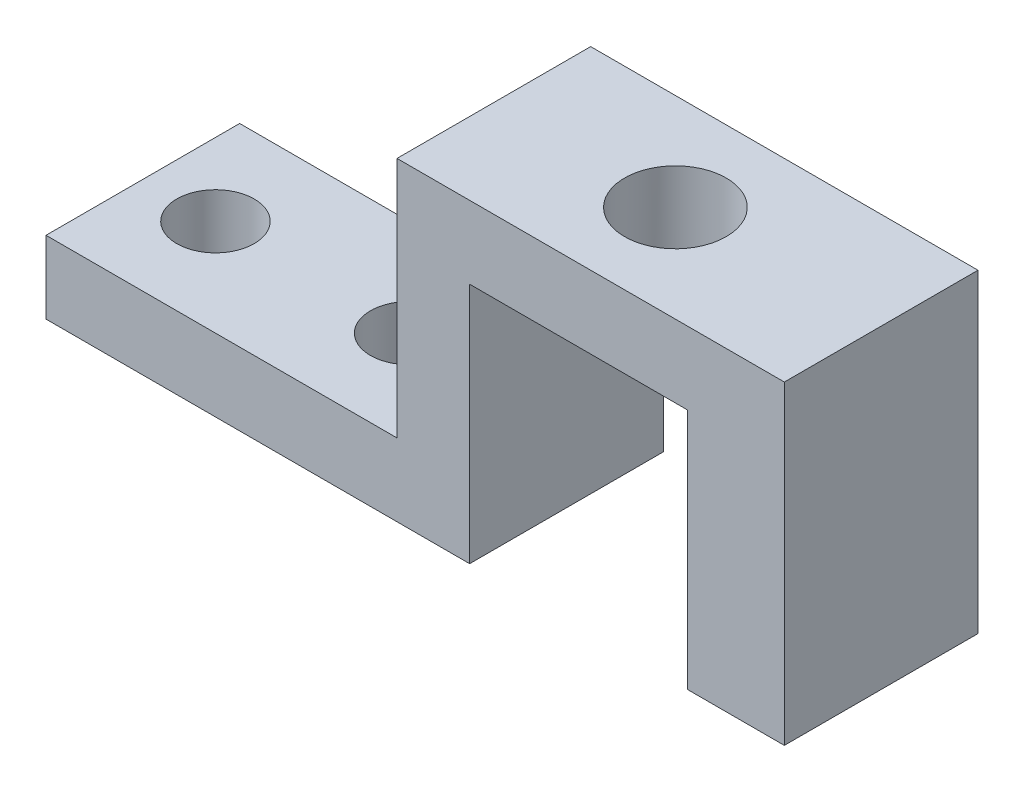
ISO-10303-21;
HEADER;
FILE_DESCRIPTION(('STEP AP214'),'2;1');
FILE_NAME('part.step','',(''),(''),'','','');
FILE_SCHEMA(('AUTOMOTIVE_DESIGN { 1 0 10303 214 1 1 1 1 }'));
ENDSEC;
DATA;
#1=APPLICATION_CONTEXT('core data for automotive mechanical design processes');
#2=APPLICATION_PROTOCOL_DEFINITION('international standard','automotive_design',2000,#1);
#3=PRODUCT_CONTEXT('',#1,'mechanical');
#4=PRODUCT('Part','Part','',(#3));
#5=PRODUCT_RELATED_PRODUCT_CATEGORY('part','',(#4));
#6=PRODUCT_DEFINITION_FORMATION('','',#4);
#7=PRODUCT_DEFINITION_CONTEXT('part definition',#1,'design');
#8=PRODUCT_DEFINITION('design','',#6,#7);
#9=PRODUCT_DEFINITION_SHAPE('','',#8);
#10=(LENGTH_UNIT() NAMED_UNIT(*) SI_UNIT(.MILLI.,.METRE.));
#11=(NAMED_UNIT(*) PLANE_ANGLE_UNIT() SI_UNIT($,.RADIAN.));
#12=(NAMED_UNIT(*) SI_UNIT($,.STERADIAN.) SOLID_ANGLE_UNIT());
#13=UNCERTAINTY_MEASURE_WITH_UNIT(LENGTH_MEASURE(1.E-05),#10,'distance_accuracy_value','');
#14=(GEOMETRIC_REPRESENTATION_CONTEXT(3) GLOBAL_UNCERTAINTY_ASSIGNED_CONTEXT((#13)) GLOBAL_UNIT_ASSIGNED_CONTEXT((#10,
#11,#12)) REPRESENTATION_CONTEXT('',''));
#15=CARTESIAN_POINT('',(0.,0.,0.));
#16=DIRECTION('',(0.,0.,1.));
#17=DIRECTION('',(1.,0.,0.));
#18=AXIS2_PLACEMENT_3D('',#15,#16,#17);
#19=CARTESIAN_POINT('',(17.5,0.,8.));
#20=DIRECTION('',(0.,1.,0.));
#21=DIRECTION('',(0.,0.,1.));
#22=AXIS2_PLACEMENT_3D('',#19,#20,#21);
#23=PLANE('',#22);
#24=CARTESIAN_POINT('',(3.,0.,4.));
#25=DIRECTION('',(0.,-1.,0.));
#26=DIRECTION('',(1.,0.,0.));
#27=AXIS2_PLACEMENT_3D('',#24,#25,#26);
#28=CIRCLE('',#27,1.6);
#29=CARTESIAN_POINT('',(4.6,0.,4.));
#30=VERTEX_POINT('',#29);
#31=EDGE_CURVE('E182',#30,#30,#28,.T.);
#32=ORIENTED_EDGE('',*,*,#31,.F.);
#33=EDGE_LOOP('',(#32));
#34=FACE_BOUND('',#33,.T.);
#35=CARTESIAN_POINT('',(11.,0.,4.));
#36=DIRECTION('',(0.,-1.,0.));
#37=DIRECTION('',(1.,0.,0.));
#38=AXIS2_PLACEMENT_3D('',#35,#36,#37);
#39=CIRCLE('',#38,1.6);
#40=CARTESIAN_POINT('',(12.6,0.,4.));
#41=VERTEX_POINT('',#40);
#42=EDGE_CURVE('E187',#41,#41,#39,.T.);
#43=ORIENTED_EDGE('',*,*,#42,.F.);
#44=EDGE_LOOP('',(#43));
#45=FACE_BOUND('',#44,.T.);
#46=DIRECTION('',(1.,0.,0.));
#47=VECTOR('',#46,1.);
#48=CARTESIAN_POINT('',(17.5,0.,0.));
#49=LINE('',#48,#47);
#50=CARTESIAN_POINT('',(0.,0.,0.));
#51=VERTEX_POINT('',#50);
#52=CARTESIAN_POINT('',(17.5,0.,0.));
#53=VERTEX_POINT('',#52);
#54=EDGE_CURVE('E144',#51,#53,#49,.T.);
#55=ORIENTED_EDGE('',*,*,#54,.T.);
#56=DIRECTION('',(0.,0.,-1.));
#57=VECTOR('',#56,1.);
#58=CARTESIAN_POINT('',(17.5,0.,8.));
#59=LINE('',#58,#57);
#60=CARTESIAN_POINT('',(17.5,0.,8.));
#61=VERTEX_POINT('',#60);
#62=EDGE_CURVE('E11',#61,#53,#59,.T.);
#63=ORIENTED_EDGE('',*,*,#62,.F.);
#64=DIRECTION('',(1.,0.,0.));
#65=VECTOR('',#64,1.);
#66=CARTESIAN_POINT('',(17.5,0.,8.));
#67=LINE('',#66,#65);
#68=CARTESIAN_POINT('',(0.,0.,8.));
#69=VERTEX_POINT('',#68);
#70=EDGE_CURVE('E163',#69,#61,#67,.T.);
#71=ORIENTED_EDGE('',*,*,#70,.F.);
#72=DIRECTION('',(0.,0.,-1.));
#73=VECTOR('',#72,1.);
#74=CARTESIAN_POINT('',(0.,0.,8.));
#75=LINE('',#74,#73);
#76=EDGE_CURVE('E140',#69,#51,#75,.T.);
#77=ORIENTED_EDGE('',*,*,#76,.T.);
#78=EDGE_LOOP('',(#55,#63,#71,#77));
#79=FACE_BOUND('',#78,.T.);
#80=ADVANCED_FACE('F34',(#34,#45,#79),#23,.F.);
#81=CARTESIAN_POINT('',(17.5,10.,8.));
#82=DIRECTION('',(-1.,0.,0.));
#83=DIRECTION('',(0.,0.,1.));
#84=AXIS2_PLACEMENT_3D('',#81,#82,#83);
#85=PLANE('',#84);
#86=DIRECTION('',(0.,1.,0.));
#87=VECTOR('',#86,1.);
#88=CARTESIAN_POINT('',(17.5,10.,0.));
#89=LINE('',#88,#87);
#90=CARTESIAN_POINT('',(17.5,10.,0.));
#91=VERTEX_POINT('',#90);
#92=EDGE_CURVE('E147',#53,#91,#89,.T.);
#93=ORIENTED_EDGE('',*,*,#92,.T.);
#94=DIRECTION('',(0.,0.,-1.));
#95=VECTOR('',#94,1.);
#96=CARTESIAN_POINT('',(17.5,10.,8.));
#97=LINE('',#96,#95);
#98=CARTESIAN_POINT('',(17.5,10.,8.));
#99=VERTEX_POINT('',#98);
#100=EDGE_CURVE('E43',#99,#91,#97,.T.);
#101=ORIENTED_EDGE('',*,*,#100,.F.);
#102=DIRECTION('',(0.,1.,0.));
#103=VECTOR('',#102,1.);
#104=CARTESIAN_POINT('',(17.5,10.,8.));
#105=LINE('',#104,#103);
#106=EDGE_CURVE('E101',#61,#99,#105,.T.);
#107=ORIENTED_EDGE('',*,*,#106,.F.);
#108=ORIENTED_EDGE('',*,*,#62,.T.);
#109=EDGE_LOOP('',(#93,#101,#107,#108));
#110=FACE_BOUND('',#109,.T.);
#111=ADVANCED_FACE('F237',(#110),#85,.F.);
#112=CARTESIAN_POINT('',(26.5,10.,8.));
#113=DIRECTION('',(0.,1.,0.));
#114=DIRECTION('',(-1.,0.,0.));
#115=AXIS2_PLACEMENT_3D('',#112,#113,#114);
#116=PLANE('',#115);
#117=CARTESIAN_POINT('',(22.,10.,4.));
#118=DIRECTION('',(0.,1.,0.));
#119=DIRECTION('',(-1.,0.,0.));
#120=AXIS2_PLACEMENT_3D('',#117,#118,#119);
#121=CIRCLE('',#120,2.1);
#122=CARTESIAN_POINT('',(19.9,10.,4.));
#123=VERTEX_POINT('',#122);
#124=EDGE_CURVE('E148',#123,#123,#121,.T.);
#125=ORIENTED_EDGE('',*,*,#124,.T.);
#126=EDGE_LOOP('',(#125));
#127=FACE_BOUND('',#126,.T.);
#128=DIRECTION('',(1.,0.,0.));
#129=VECTOR('',#128,1.);
#130=CARTESIAN_POINT('',(26.5,10.,0.));
#131=LINE('',#130,#129);
#132=CARTESIAN_POINT('',(26.5,10.,0.));
#133=VERTEX_POINT('',#132);
#134=EDGE_CURVE('E150',#91,#133,#131,.T.);
#135=ORIENTED_EDGE('',*,*,#134,.T.);
#136=DIRECTION('',(0.,0.,-1.));
#137=VECTOR('',#136,1.);
#138=CARTESIAN_POINT('',(26.5,10.,8.));
#139=LINE('',#138,#137);
#140=CARTESIAN_POINT('',(26.5,10.,8.));
#141=VERTEX_POINT('',#140);
#142=EDGE_CURVE('E176',#141,#133,#139,.T.);
#143=ORIENTED_EDGE('',*,*,#142,.F.);
#144=DIRECTION('',(1.,0.,0.));
#145=VECTOR('',#144,1.);
#146=CARTESIAN_POINT('',(26.5,10.,8.));
#147=LINE('',#146,#145);
#148=EDGE_CURVE('E201',#99,#141,#147,.T.);
#149=ORIENTED_EDGE('',*,*,#148,.F.);
#150=ORIENTED_EDGE('',*,*,#100,.T.);
#151=EDGE_LOOP('',(#135,#143,#149,#150));
#152=FACE_BOUND('',#151,.T.);
#153=ADVANCED_FACE('F242',(#127,#152),#116,.F.);
#154=CARTESIAN_POINT('',(26.5,0.,8.));
#155=DIRECTION('',(1.,0.,0.));
#156=DIRECTION('',(0.,1.,0.));
#157=AXIS2_PLACEMENT_3D('',#154,#155,#156);
#158=PLANE('',#157);
#159=DIRECTION('',(0.,-1.,0.));
#160=VECTOR('',#159,1.);
#161=CARTESIAN_POINT('',(26.5,0.,0.));
#162=LINE('',#161,#160);
#163=CARTESIAN_POINT('',(26.5,0.,0.));
#164=VERTEX_POINT('',#163);
#165=EDGE_CURVE('E152',#133,#164,#162,.T.);
#166=ORIENTED_EDGE('',*,*,#165,.T.);
#167=DIRECTION('',(0.,0.,-1.));
#168=VECTOR('',#167,1.);
#169=CARTESIAN_POINT('',(26.5,0.,8.));
#170=LINE('',#169,#168);
#171=CARTESIAN_POINT('',(26.5,0.,8.));
#172=VERTEX_POINT('',#171);
#173=EDGE_CURVE('E173',#172,#164,#170,.T.);
#174=ORIENTED_EDGE('',*,*,#173,.F.);
#175=DIRECTION('',(0.,-1.,0.));
#176=VECTOR('',#175,1.);
#177=CARTESIAN_POINT('',(26.5,0.,8.));
#178=LINE('',#177,#176);
#179=EDGE_CURVE('E203',#141,#172,#178,.T.);
#180=ORIENTED_EDGE('',*,*,#179,.F.);
#181=ORIENTED_EDGE('',*,*,#142,.T.);
#182=EDGE_LOOP('',(#166,#174,#180,#181));
#183=FACE_BOUND('',#182,.T.);
#184=ADVANCED_FACE('F268',(#183),#158,.F.);
#185=CARTESIAN_POINT('',(30.5,0.,8.));
#186=DIRECTION('',(0.,1.,0.));
#187=DIRECTION('',(-1.,0.,0.));
#188=AXIS2_PLACEMENT_3D('',#185,#186,#187);
#189=PLANE('',#188);
#190=DIRECTION('',(1.,0.,0.));
#191=VECTOR('',#190,1.);
#192=CARTESIAN_POINT('',(30.5,0.,0.));
#193=LINE('',#192,#191);
#194=CARTESIAN_POINT('',(30.5,0.,0.));
#195=VERTEX_POINT('',#194);
#196=EDGE_CURVE('E154',#164,#195,#193,.T.);
#197=ORIENTED_EDGE('',*,*,#196,.T.);
#198=DIRECTION('',(0.,0.,-1.));
#199=VECTOR('',#198,1.);
#200=CARTESIAN_POINT('',(30.5,0.,8.));
#201=LINE('',#200,#199);
#202=CARTESIAN_POINT('',(30.5,0.,8.));
#203=VERTEX_POINT('',#202);
#204=EDGE_CURVE('E170',#203,#195,#201,.T.);
#205=ORIENTED_EDGE('',*,*,#204,.F.);
#206=DIRECTION('',(1.,0.,0.));
#207=VECTOR('',#206,1.);
#208=CARTESIAN_POINT('',(30.5,0.,8.));
#209=LINE('',#208,#207);
#210=EDGE_CURVE('E205',#172,#203,#209,.T.);
#211=ORIENTED_EDGE('',*,*,#210,.F.);
#212=ORIENTED_EDGE('',*,*,#173,.T.);
#213=EDGE_LOOP('',(#197,#205,#211,#212));
#214=FACE_BOUND('',#213,.T.);
#215=ADVANCED_FACE('F278',(#214),#189,.F.);
#216=CARTESIAN_POINT('',(30.5,13.,8.));
#217=DIRECTION('',(-1.,0.,0.));
#218=DIRECTION('',(0.,-1.,0.));
#219=AXIS2_PLACEMENT_3D('',#216,#217,#218);
#220=PLANE('',#219);
#221=DIRECTION('',(0.,1.,0.));
#222=VECTOR('',#221,1.);
#223=CARTESIAN_POINT('',(30.5,13.,0.));
#224=LINE('',#223,#222);
#225=CARTESIAN_POINT('',(30.5,13.,0.));
#226=VERTEX_POINT('',#225);
#227=EDGE_CURVE('E156',#195,#226,#224,.T.);
#228=ORIENTED_EDGE('',*,*,#227,.T.);
#229=DIRECTION('',(0.,0.,-1.));
#230=VECTOR('',#229,1.);
#231=CARTESIAN_POINT('',(30.5,13.,8.));
#232=LINE('',#231,#230);
#233=CARTESIAN_POINT('',(30.5,13.,8.));
#234=VERTEX_POINT('',#233);
#235=EDGE_CURVE('E167',#234,#226,#232,.T.);
#236=ORIENTED_EDGE('',*,*,#235,.F.);
#237=DIRECTION('',(0.,1.,0.));
#238=VECTOR('',#237,1.);
#239=CARTESIAN_POINT('',(30.5,13.,8.));
#240=LINE('',#239,#238);
#241=EDGE_CURVE('E207',#203,#234,#240,.T.);
#242=ORIENTED_EDGE('',*,*,#241,.F.);
#243=ORIENTED_EDGE('',*,*,#204,.T.);
#244=EDGE_LOOP('',(#228,#236,#242,#243));
#245=FACE_BOUND('',#244,.T.);
#246=ADVANCED_FACE('F213',(#245),#220,.F.);
#247=CARTESIAN_POINT('',(14.5,13.,8.));
#248=DIRECTION('',(0.,-1.,0.));
#249=DIRECTION('',(0.,0.,-1.));
#250=AXIS2_PLACEMENT_3D('',#247,#248,#249);
#251=PLANE('',#250);
#252=CARTESIAN_POINT('',(22.,13.,4.));
#253=DIRECTION('',(0.,-1.,0.));
#254=DIRECTION('',(1.,0.,0.));
#255=AXIS2_PLACEMENT_3D('',#252,#253,#254);
#256=CIRCLE('',#255,2.1);
#257=CARTESIAN_POINT('',(24.1,13.,4.));
#258=VERTEX_POINT('',#257);
#259=EDGE_CURVE('E192',#258,#258,#256,.T.);
#260=ORIENTED_EDGE('',*,*,#259,.T.);
#261=EDGE_LOOP('',(#260));
#262=FACE_BOUND('',#261,.T.);
#263=DIRECTION('',(-1.,0.,0.));
#264=VECTOR('',#263,1.);
#265=CARTESIAN_POINT('',(14.5,13.,0.));
#266=LINE('',#265,#264);
#267=CARTESIAN_POINT('',(14.5,13.,0.));
#268=VERTEX_POINT('',#267);
#269=EDGE_CURVE('E158',#226,#268,#266,.T.);
#270=ORIENTED_EDGE('',*,*,#269,.T.);
#271=DIRECTION('',(0.,0.,-1.));
#272=VECTOR('',#271,1.);
#273=CARTESIAN_POINT('',(14.5,13.,8.));
#274=LINE('',#273,#272);
#275=CARTESIAN_POINT('',(14.5,13.,8.));
#276=VERTEX_POINT('',#275);
#277=EDGE_CURVE('E135',#276,#268,#274,.T.);
#278=ORIENTED_EDGE('',*,*,#277,.F.);
#279=DIRECTION('',(-1.,0.,0.));
#280=VECTOR('',#279,1.);
#281=CARTESIAN_POINT('',(14.5,13.,8.));
#282=LINE('',#281,#280);
#283=EDGE_CURVE('E126',#234,#276,#282,.T.);
#284=ORIENTED_EDGE('',*,*,#283,.F.);
#285=ORIENTED_EDGE('',*,*,#235,.T.);
#286=EDGE_LOOP('',(#270,#278,#284,#285));
#287=FACE_BOUND('',#286,.T.);
#288=ADVANCED_FACE('F217',(#262,#287),#251,.F.);
#289=CARTESIAN_POINT('',(14.5,3.,8.));
#290=DIRECTION('',(1.,0.,0.));
#291=DIRECTION('',(0.,0.,-1.));
#292=AXIS2_PLACEMENT_3D('',#289,#290,#291);
#293=PLANE('',#292);
#294=DIRECTION('',(0.,-1.,0.));
#295=VECTOR('',#294,1.);
#296=CARTESIAN_POINT('',(14.5,3.,0.));
#297=LINE('',#296,#295);
#298=CARTESIAN_POINT('',(14.5,3.,0.));
#299=VERTEX_POINT('',#298);
#300=EDGE_CURVE('E134',#268,#299,#297,.T.);
#301=ORIENTED_EDGE('',*,*,#300,.T.);
#302=DIRECTION('',(0.,0.,-1.));
#303=VECTOR('',#302,1.);
#304=CARTESIAN_POINT('',(14.5,3.,8.));
#305=LINE('',#304,#303);
#306=CARTESIAN_POINT('',(14.5,3.,8.));
#307=VERTEX_POINT('',#306);
#308=EDGE_CURVE('E131',#307,#299,#305,.T.);
#309=ORIENTED_EDGE('',*,*,#308,.F.);
#310=DIRECTION('',(0.,-1.,0.));
#311=VECTOR('',#310,1.);
#312=CARTESIAN_POINT('',(14.5,3.,8.));
#313=LINE('',#312,#311);
#314=EDGE_CURVE('E120',#276,#307,#313,.T.);
#315=ORIENTED_EDGE('',*,*,#314,.F.);
#316=ORIENTED_EDGE('',*,*,#277,.T.);
#317=EDGE_LOOP('',(#301,#309,#315,#316));
#318=FACE_BOUND('',#317,.T.);
#319=ADVANCED_FACE('F132',(#318),#293,.F.);
#320=CARTESIAN_POINT('',(0.,3.,8.));
#321=DIRECTION('',(0.,-1.,0.));
#322=DIRECTION('',(1.,0.,0.));
#323=AXIS2_PLACEMENT_3D('',#320,#321,#322);
#324=PLANE('',#323);
#325=CARTESIAN_POINT('',(3.,3.,4.));
#326=DIRECTION('',(0.,-1.,0.));
#327=DIRECTION('',(1.,0.,0.));
#328=AXIS2_PLACEMENT_3D('',#325,#326,#327);
#329=CIRCLE('',#328,1.6);
#330=CARTESIAN_POINT('',(4.6,3.,4.));
#331=VERTEX_POINT('',#330);
#332=EDGE_CURVE('E37',#331,#331,#329,.T.);
#333=ORIENTED_EDGE('',*,*,#332,.T.);
#334=EDGE_LOOP('',(#333));
#335=FACE_BOUND('',#334,.T.);
#336=CARTESIAN_POINT('',(11.,3.,4.));
#337=DIRECTION('',(0.,-1.,0.));
#338=DIRECTION('',(1.,0.,0.));
#339=AXIS2_PLACEMENT_3D('',#336,#337,#338);
#340=CIRCLE('',#339,1.6);
#341=CARTESIAN_POINT('',(12.6,3.,4.));
#342=VERTEX_POINT('',#341);
#343=EDGE_CURVE('E180',#342,#342,#340,.T.);
#344=ORIENTED_EDGE('',*,*,#343,.T.);
#345=EDGE_LOOP('',(#344));
#346=FACE_BOUND('',#345,.T.);
#347=DIRECTION('',(-1.,0.,0.));
#348=VECTOR('',#347,1.);
#349=CARTESIAN_POINT('',(0.,3.,0.));
#350=LINE('',#349,#348);
#351=CARTESIAN_POINT('',(0.,3.,0.));
#352=VERTEX_POINT('',#351);
#353=EDGE_CURVE('E87',#299,#352,#350,.T.);
#354=ORIENTED_EDGE('',*,*,#353,.T.);
#355=DIRECTION('',(0.,0.,-1.));
#356=VECTOR('',#355,1.);
#357=CARTESIAN_POINT('',(0.,3.,8.));
#358=LINE('',#357,#356);
#359=CARTESIAN_POINT('',(0.,3.,8.));
#360=VERTEX_POINT('',#359);
#361=EDGE_CURVE('E136',#360,#352,#358,.T.);
#362=ORIENTED_EDGE('',*,*,#361,.F.);
#363=DIRECTION('',(-1.,0.,0.));
#364=VECTOR('',#363,1.);
#365=CARTESIAN_POINT('',(0.,3.,8.));
#366=LINE('',#365,#364);
#367=EDGE_CURVE('E124',#307,#360,#366,.T.);
#368=ORIENTED_EDGE('',*,*,#367,.F.);
#369=ORIENTED_EDGE('',*,*,#308,.T.);
#370=EDGE_LOOP('',(#354,#362,#368,#369));
#371=FACE_BOUND('',#370,.T.);
#372=ADVANCED_FACE('F138',(#335,#346,#371),#324,.F.);
#373=CARTESIAN_POINT('',(0.,0.,8.));
#374=DIRECTION('',(1.,0.,0.));
#375=DIRECTION('',(0.,0.,-1.));
#376=AXIS2_PLACEMENT_3D('',#373,#374,#375);
#377=PLANE('',#376);
#378=DIRECTION('',(0.,-1.,0.));
#379=VECTOR('',#378,1.);
#380=CARTESIAN_POINT('',(0.,0.,0.));
#381=LINE('',#380,#379);
#382=EDGE_CURVE('E93',#352,#51,#381,.T.);
#383=ORIENTED_EDGE('',*,*,#382,.T.);
#384=ORIENTED_EDGE('',*,*,#76,.F.);
#385=DIRECTION('',(0.,-1.,0.));
#386=VECTOR('',#385,1.);
#387=CARTESIAN_POINT('',(0.,0.,8.));
#388=LINE('',#387,#386);
#389=EDGE_CURVE('E52',#360,#69,#388,.T.);
#390=ORIENTED_EDGE('',*,*,#389,.F.);
#391=ORIENTED_EDGE('',*,*,#361,.T.);
#392=EDGE_LOOP('',(#383,#384,#390,#391));
#393=FACE_BOUND('',#392,.T.);
#394=ADVANCED_FACE('F225',(#393),#377,.F.);
#395=CARTESIAN_POINT('',(0.,0.,8.));
#396=DIRECTION('',(0.,0.,-1.));
#397=DIRECTION('',(-1.,0.,0.));
#398=AXIS2_PLACEMENT_3D('',#395,#396,#397);
#399=PLANE('',#398);
#400=ORIENTED_EDGE('',*,*,#70,.T.);
#401=ORIENTED_EDGE('',*,*,#106,.T.);
#402=ORIENTED_EDGE('',*,*,#148,.T.);
#403=ORIENTED_EDGE('',*,*,#179,.T.);
#404=ORIENTED_EDGE('',*,*,#210,.T.);
#405=ORIENTED_EDGE('',*,*,#241,.T.);
#406=ORIENTED_EDGE('',*,*,#283,.T.);
#407=ORIENTED_EDGE('',*,*,#314,.T.);
#408=ORIENTED_EDGE('',*,*,#367,.T.);
#409=ORIENTED_EDGE('',*,*,#389,.T.);
#410=EDGE_LOOP('',(#400,#401,#402,#403,#404,#405,#406,#407,#408,#409));
#411=FACE_BOUND('',#410,.T.);
#412=ADVANCED_FACE('F122',(#411),#399,.F.);
#413=CARTESIAN_POINT('',(0.,0.,0.));
#414=DIRECTION('',(0.,0.,-1.));
#415=DIRECTION('',(-1.,0.,0.));
#416=AXIS2_PLACEMENT_3D('',#413,#414,#415);
#417=PLANE('',#416);
#418=ORIENTED_EDGE('',*,*,#54,.F.);
#419=ORIENTED_EDGE('',*,*,#382,.F.);
#420=ORIENTED_EDGE('',*,*,#353,.F.);
#421=ORIENTED_EDGE('',*,*,#300,.F.);
#422=ORIENTED_EDGE('',*,*,#269,.F.);
#423=ORIENTED_EDGE('',*,*,#227,.F.);
#424=ORIENTED_EDGE('',*,*,#196,.F.);
#425=ORIENTED_EDGE('',*,*,#165,.F.);
#426=ORIENTED_EDGE('',*,*,#134,.F.);
#427=ORIENTED_EDGE('',*,*,#92,.F.);
#428=EDGE_LOOP('',(#418,#419,#420,#421,#422,#423,#424,#425,#426,#427));
#429=FACE_BOUND('',#428,.T.);
#430=ADVANCED_FACE('F220',(#429),#417,.T.);
#431=CARTESIAN_POINT('',(11.,13.,4.));
#432=DIRECTION('',(0.,-1.,0.));
#433=DIRECTION('',(1.,0.,0.));
#434=AXIS2_PLACEMENT_3D('',#431,#432,#433);
#435=CYLINDRICAL_SURFACE('',#434,1.6);
#436=ORIENTED_EDGE('',*,*,#42,.T.);
#437=EDGE_LOOP('',(#436));
#438=FACE_BOUND('',#437,.T.);
#439=ORIENTED_EDGE('',*,*,#343,.F.);
#440=EDGE_LOOP('',(#439));
#441=FACE_BOUND('',#440,.T.);
#442=ADVANCED_FACE('F246',(#438,#441),#435,.F.);
#443=CARTESIAN_POINT('',(3.,13.,4.));
#444=DIRECTION('',(0.,-1.,0.));
#445=DIRECTION('',(1.,0.,0.));
#446=AXIS2_PLACEMENT_3D('',#443,#444,#445);
#447=CYLINDRICAL_SURFACE('',#446,1.6);
#448=ORIENTED_EDGE('',*,*,#31,.T.);
#449=EDGE_LOOP('',(#448));
#450=FACE_BOUND('',#449,.T.);
#451=ORIENTED_EDGE('',*,*,#332,.F.);
#452=EDGE_LOOP('',(#451));
#453=FACE_BOUND('',#452,.T.);
#454=ADVANCED_FACE('F249',(#450,#453),#447,.F.);
#455=CARTESIAN_POINT('',(22.,13.,4.));
#456=DIRECTION('',(0.,-1.,0.));
#457=DIRECTION('',(1.,0.,0.));
#458=AXIS2_PLACEMENT_3D('',#455,#456,#457);
#459=CYLINDRICAL_SURFACE('',#458,2.1);
#460=ORIENTED_EDGE('',*,*,#259,.F.);
#461=EDGE_LOOP('',(#460));
#462=FACE_BOUND('',#461,.T.);
#463=ORIENTED_EDGE('',*,*,#124,.F.);
#464=EDGE_LOOP('',(#463));
#465=FACE_BOUND('',#464,.T.);
#466=ADVANCED_FACE('F255',(#462,#465),#459,.F.);
#467=CLOSED_SHELL('',(#80,#111,#153,#184,#215,#246,#288,#319,#372,#394,#412,#430,#442,#454,#466));
#468=MANIFOLD_SOLID_BREP('B2',#467);
#469=ADVANCED_BREP_SHAPE_REPRESENTATION('',(#18,#468),#14);
#470=SHAPE_DEFINITION_REPRESENTATION(#9,#469);
ENDSEC;
END-ISO-10303-21;
